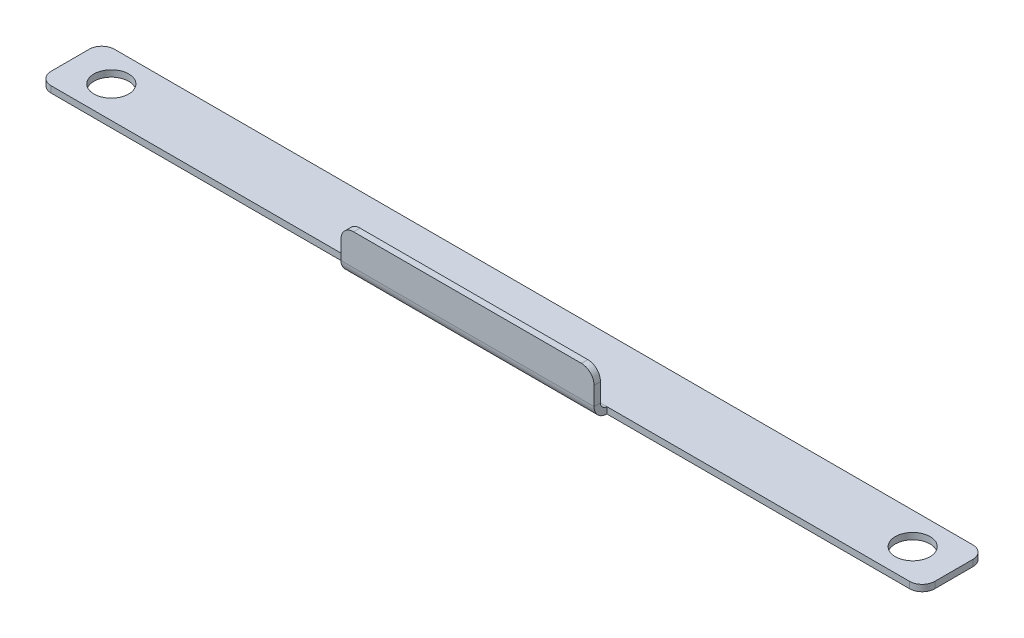
ISO-10303-21;
HEADER;
FILE_DESCRIPTION(('STEP AP214'),'2;1');
FILE_NAME('part.step','',(''),(''),'','','');
FILE_SCHEMA(('AUTOMOTIVE_DESIGN { 1 0 10303 214 1 1 1 1 }'));
ENDSEC;
DATA;
#1=APPLICATION_CONTEXT('core data for automotive mechanical design processes');
#2=APPLICATION_PROTOCOL_DEFINITION('international standard','automotive_design',2000,#1);
#3=PRODUCT_CONTEXT('',#1,'mechanical');
#4=PRODUCT('Part','Part','',(#3));
#5=PRODUCT_RELATED_PRODUCT_CATEGORY('part','',(#4));
#6=PRODUCT_DEFINITION_FORMATION('','',#4);
#7=PRODUCT_DEFINITION_CONTEXT('part definition',#1,'design');
#8=PRODUCT_DEFINITION('design','',#6,#7);
#9=PRODUCT_DEFINITION_SHAPE('','',#8);
#10=(LENGTH_UNIT() NAMED_UNIT(*) SI_UNIT(.MILLI.,.METRE.));
#11=(NAMED_UNIT(*) PLANE_ANGLE_UNIT() SI_UNIT($,.RADIAN.));
#12=(NAMED_UNIT(*) SI_UNIT($,.STERADIAN.) SOLID_ANGLE_UNIT());
#13=UNCERTAINTY_MEASURE_WITH_UNIT(LENGTH_MEASURE(1.E-05),#10,'distance_accuracy_value','');
#14=(GEOMETRIC_REPRESENTATION_CONTEXT(3) GLOBAL_UNCERTAINTY_ASSIGNED_CONTEXT((#13)) GLOBAL_UNIT_ASSIGNED_CONTEXT((#10,
#11,#12)) REPRESENTATION_CONTEXT('',''));
#15=CARTESIAN_POINT('',(0.,0.,0.));
#16=DIRECTION('',(0.,0.,1.));
#17=DIRECTION('',(1.,0.,0.));
#18=AXIS2_PLACEMENT_3D('',#15,#16,#17);
#19=CARTESIAN_POINT('',(-126.85050997759,-1.016,0.));
#20=DIRECTION('',(0.,0.,1.));
#21=DIRECTION('',(1.,0.,0.));
#22=AXIS2_PLACEMENT_3D('',#19,#20,#21);
#23=PLANE('',#22);
#24=DIRECTION('',(1.,0.,0.));
#25=VECTOR('',#24,1.);
#26=CARTESIAN_POINT('',(-126.85050997759,-1.016,0.));
#27=LINE('',#26,#25);
#28=CARTESIAN_POINT('',(-37.0255099775869,-1.016,0.));
#29=VERTEX_POINT('',#28);
#30=CARTESIAN_POINT('',(10.7994900224159,-1.016,0.));
#31=VERTEX_POINT('',#30);
#32=EDGE_CURVE('E246',#29,#31,#27,.T.);
#33=ORIENTED_EDGE('',*,*,#32,.T.);
#34=DIRECTION('',(0.,1.,0.));
#35=VECTOR('',#34,1.);
#36=CARTESIAN_POINT('',(10.7994900224159,-1.016,0.));
#37=LINE('',#36,#35);
#38=CARTESIAN_POINT('',(10.7994900224159,0.,0.));
#39=VERTEX_POINT('',#38);
#40=EDGE_CURVE('E13',#31,#39,#37,.T.);
#41=ORIENTED_EDGE('',*,*,#40,.T.);
#42=DIRECTION('',(1.,0.,0.));
#43=VECTOR('',#42,1.);
#44=CARTESIAN_POINT('',(-126.85050997759,0.,0.));
#45=LINE('',#44,#43);
#46=CARTESIAN_POINT('',(-37.0255099775869,0.,0.));
#47=VERTEX_POINT('',#46);
#48=EDGE_CURVE('E259',#47,#39,#45,.T.);
#49=ORIENTED_EDGE('',*,*,#48,.F.);
#50=DIRECTION('',(0.,-1.,0.));
#51=VECTOR('',#50,1.);
#52=CARTESIAN_POINT('',(-37.0255099775869,0.,0.));
#53=LINE('',#52,#51);
#54=EDGE_CURVE('E230',#47,#29,#53,.T.);
#55=ORIENTED_EDGE('',*,*,#54,.T.);
#56=EDGE_LOOP('',(#33,#41,#49,#55));
#57=FACE_BOUND('',#56,.T.);
#58=ADVANCED_FACE('F57',(#57),#23,.T.);
#59=CARTESIAN_POINT('',(-126.85050997759,-1.016,-10.));
#60=DIRECTION('',(-1.,0.,0.));
#61=DIRECTION('',(0.,0.,1.));
#62=AXIS2_PLACEMENT_3D('',#59,#60,#61);
#63=PLANE('',#62);
#64=DIRECTION('',(0.,0.,1.));
#65=VECTOR('',#64,1.);
#66=CARTESIAN_POINT('',(-126.85050997759,0.,-10.));
#67=LINE('',#66,#65);
#68=CARTESIAN_POINT('',(-126.85050997759,0.,-8.));
#69=VERTEX_POINT('',#68);
#70=CARTESIAN_POINT('',(-126.85050997759,0.,-2.));
#71=VERTEX_POINT('',#70);
#72=EDGE_CURVE('E241',#69,#71,#67,.T.);
#73=ORIENTED_EDGE('',*,*,#72,.F.);
#74=DIRECTION('',(0.,1.,0.));
#75=VECTOR('',#74,1.);
#76=CARTESIAN_POINT('',(-126.85050997759,-1.016,-8.));
#77=LINE('',#76,#75);
#78=CARTESIAN_POINT('',(-126.85050997759,-1.016,-8.));
#79=VERTEX_POINT('',#78);
#80=EDGE_CURVE('E299',#69,#79,#77,.F.);
#81=ORIENTED_EDGE('',*,*,#80,.T.);
#82=DIRECTION('',(0.,0.,1.));
#83=VECTOR('',#82,1.);
#84=CARTESIAN_POINT('',(-126.85050997759,-1.016,-10.));
#85=LINE('',#84,#83);
#86=CARTESIAN_POINT('',(-126.85050997759,-1.016,-2.));
#87=VERTEX_POINT('',#86);
#88=EDGE_CURVE('E243',#79,#87,#85,.T.);
#89=ORIENTED_EDGE('',*,*,#88,.T.);
#90=DIRECTION('',(0.,1.,0.));
#91=VECTOR('',#90,1.);
#92=CARTESIAN_POINT('',(-126.85050997759,-1.016,-2.));
#93=LINE('',#92,#91);
#94=EDGE_CURVE('E296',#87,#71,#93,.T.);
#95=ORIENTED_EDGE('',*,*,#94,.T.);
#96=EDGE_LOOP('',(#73,#81,#89,#95));
#97=FACE_BOUND('',#96,.T.);
#98=ADVANCED_FACE('F336',(#97),#63,.T.);
#99=CARTESIAN_POINT('',(-126.85050997759,-1.016,-10.));
#100=DIRECTION('',(0.,0.,-1.));
#101=DIRECTION('',(-1.,0.,0.));
#102=AXIS2_PLACEMENT_3D('',#99,#100,#101);
#103=PLANE('',#102);
#104=DIRECTION('',(-1.,0.,0.));
#105=VECTOR('',#104,1.);
#106=CARTESIAN_POINT('',(-126.85050997759,-1.016,-10.));
#107=LINE('',#106,#105);
#108=CARTESIAN_POINT('',(10.7994900224159,-1.016,-10.));
#109=VERTEX_POINT('',#108);
#110=CARTESIAN_POINT('',(-124.85050997759,-1.016,-10.));
#111=VERTEX_POINT('',#110);
#112=EDGE_CURVE('E253',#109,#111,#107,.T.);
#113=ORIENTED_EDGE('',*,*,#112,.T.);
#114=DIRECTION('',(0.,1.,0.));
#115=VECTOR('',#114,1.);
#116=CARTESIAN_POINT('',(-124.85050997759,-1.016,-10.));
#117=LINE('',#116,#115);
#118=CARTESIAN_POINT('',(-124.85050997759,0.,-10.));
#119=VERTEX_POINT('',#118);
#120=EDGE_CURVE('E285',#111,#119,#117,.T.);
#121=ORIENTED_EDGE('',*,*,#120,.T.);
#122=DIRECTION('',(-1.,0.,0.));
#123=VECTOR('',#122,1.);
#124=CARTESIAN_POINT('',(-126.85050997759,0.,-10.));
#125=LINE('',#124,#123);
#126=CARTESIAN_POINT('',(10.7994900224159,0.,-10.));
#127=VERTEX_POINT('',#126);
#128=EDGE_CURVE('E247',#127,#119,#125,.T.);
#129=ORIENTED_EDGE('',*,*,#128,.F.);
#130=DIRECTION('',(0.,1.,0.));
#131=VECTOR('',#130,1.);
#132=CARTESIAN_POINT('',(10.7994900224159,-1.016,-10.));
#133=LINE('',#132,#131);
#134=EDGE_CURVE('E283',#127,#109,#133,.F.);
#135=ORIENTED_EDGE('',*,*,#134,.T.);
#136=EDGE_LOOP('',(#113,#121,#129,#135));
#137=FACE_BOUND('',#136,.T.);
#138=ADVANCED_FACE('F343',(#137),#103,.T.);
#139=CARTESIAN_POINT('',(12.7994900224159,-1.016,-10.));
#140=DIRECTION('',(1.,0.,0.));
#141=DIRECTION('',(0.,0.,-1.));
#142=AXIS2_PLACEMENT_3D('',#139,#140,#141);
#143=PLANE('',#142);
#144=DIRECTION('',(0.,0.,-1.));
#145=VECTOR('',#144,1.);
#146=CARTESIAN_POINT('',(12.7994900224159,-1.016,-10.));
#147=LINE('',#146,#145);
#148=CARTESIAN_POINT('',(12.7994900224159,-1.016,-2.));
#149=VERTEX_POINT('',#148);
#150=CARTESIAN_POINT('',(12.7994900224159,-1.016,-8.));
#151=VERTEX_POINT('',#150);
#152=EDGE_CURVE('E250',#149,#151,#147,.T.);
#153=ORIENTED_EDGE('',*,*,#152,.T.);
#154=DIRECTION('',(0.,1.,0.));
#155=VECTOR('',#154,1.);
#156=CARTESIAN_POINT('',(12.7994900224159,-1.016,-8.));
#157=LINE('',#156,#155);
#158=CARTESIAN_POINT('',(12.7994900224159,0.,-8.));
#159=VERTEX_POINT('',#158);
#160=EDGE_CURVE('E65',#151,#159,#157,.T.);
#161=ORIENTED_EDGE('',*,*,#160,.T.);
#162=DIRECTION('',(0.,0.,-1.));
#163=VECTOR('',#162,1.);
#164=CARTESIAN_POINT('',(12.7994900224159,0.,-10.));
#165=LINE('',#164,#163);
#166=CARTESIAN_POINT('',(12.7994900224159,0.,-2.));
#167=VERTEX_POINT('',#166);
#168=EDGE_CURVE('E262',#167,#159,#165,.T.);
#169=ORIENTED_EDGE('',*,*,#168,.F.);
#170=DIRECTION('',(0.,1.,0.));
#171=VECTOR('',#170,1.);
#172=CARTESIAN_POINT('',(12.7994900224159,-1.016,-2.));
#173=LINE('',#172,#171);
#174=EDGE_CURVE('E309',#167,#149,#173,.F.);
#175=ORIENTED_EDGE('',*,*,#174,.T.);
#176=EDGE_LOOP('',(#153,#161,#169,#175));
#177=FACE_BOUND('',#176,.T.);
#178=ADVANCED_FACE('F314',(#177),#143,.T.);
#179=CARTESIAN_POINT('',(-124.85050997759,0.,0.));
#180=VERTEX_POINT('',#179);
#181=CARTESIAN_POINT('',(-77.0255099775869,0.,0.));
#182=VERTEX_POINT('',#181);
#183=EDGE_CURVE('E260',#180,#182,#45,.T.);
#184=ORIENTED_EDGE('',*,*,#183,.F.);
#185=DIRECTION('',(0.,1.,0.));
#186=VECTOR('',#185,1.);
#187=CARTESIAN_POINT('',(-124.85050997759,-1.016,0.));
#188=LINE('',#187,#186);
#189=CARTESIAN_POINT('',(-124.85050997759,-1.016,0.));
#190=VERTEX_POINT('',#189);
#191=EDGE_CURVE('E72',#180,#190,#188,.F.);
#192=ORIENTED_EDGE('',*,*,#191,.T.);
#193=CARTESIAN_POINT('',(-77.0255099775869,-1.01600000000003,0.));
#194=VERTEX_POINT('',#193);
#195=EDGE_CURVE('E248',#190,#194,#27,.T.);
#196=ORIENTED_EDGE('',*,*,#195,.T.);
#197=DIRECTION('',(0.,-1.,0.));
#198=VECTOR('',#197,1.);
#199=CARTESIAN_POINT('',(-77.0255099775869,0.,0.));
#200=LINE('',#199,#198);
#201=EDGE_CURVE('E238',#182,#194,#200,.T.);
#202=ORIENTED_EDGE('',*,*,#201,.F.);
#203=EDGE_LOOP('',(#184,#192,#196,#202));
#204=FACE_BOUND('',#203,.T.);
#205=ADVANCED_FACE('F356',(#204),#23,.T.);
#206=CARTESIAN_POINT('',(0.,-1.016,0.));
#207=DIRECTION('',(0.,1.,0.));
#208=DIRECTION('',(0.,0.,1.));
#209=AXIS2_PLACEMENT_3D('',#206,#207,#208);
#210=PLANE('',#209);
#211=CARTESIAN_POINT('',(-120.35050997759,-1.01600000000003,-4.99999999999999));
#212=DIRECTION('',(0.,1.,0.));
#213=DIRECTION('',(0.,0.,1.));
#214=AXIS2_PLACEMENT_3D('',#211,#212,#213);
#215=CIRCLE('',#214,2.75);
#216=CARTESIAN_POINT('',(-120.35050997759,-1.01600000000003,-2.24999999999999));
#217=VERTEX_POINT('',#216);
#218=EDGE_CURVE('E602',#217,#217,#215,.T.);
#219=ORIENTED_EDGE('',*,*,#218,.T.);
#220=EDGE_LOOP('',(#219));
#221=FACE_BOUND('',#220,.T.);
#222=CARTESIAN_POINT('',(6.29949002241591,-1.01600000000003,-5.));
#223=DIRECTION('',(0.,1.,0.));
#224=DIRECTION('',(0.,0.,1.));
#225=AXIS2_PLACEMENT_3D('',#222,#223,#224);
#226=CIRCLE('',#225,2.75);
#227=CARTESIAN_POINT('',(6.29949002241591,-1.01600000000003,-2.25));
#228=VERTEX_POINT('',#227);
#229=EDGE_CURVE('E227',#228,#228,#226,.T.);
#230=ORIENTED_EDGE('',*,*,#229,.T.);
#231=EDGE_LOOP('',(#230));
#232=FACE_BOUND('',#231,.T.);
#233=ORIENTED_EDGE('',*,*,#88,.F.);
#234=CARTESIAN_POINT('',(-124.85050997759,-1.016,-8.));
#235=DIRECTION('',(0.,1.,0.));
#236=DIRECTION('',(0.,0.,1.));
#237=AXIS2_PLACEMENT_3D('',#234,#235,#236);
#238=CIRCLE('',#237,2.);
#239=EDGE_CURVE('E306',#79,#111,#238,.F.);
#240=ORIENTED_EDGE('',*,*,#239,.T.);
#241=ORIENTED_EDGE('',*,*,#112,.F.);
#242=CARTESIAN_POINT('',(10.7994900224159,-1.016,-8.));
#243=DIRECTION('',(0.,1.,0.));
#244=DIRECTION('',(0.,0.,1.));
#245=AXIS2_PLACEMENT_3D('',#242,#243,#244);
#246=CIRCLE('',#245,2.);
#247=EDGE_CURVE('E302',#109,#151,#246,.F.);
#248=ORIENTED_EDGE('',*,*,#247,.T.);
#249=ORIENTED_EDGE('',*,*,#152,.F.);
#250=CARTESIAN_POINT('',(10.7994900224159,-1.016,-2.));
#251=DIRECTION('',(0.,1.,0.));
#252=DIRECTION('',(0.,0.,1.));
#253=AXIS2_PLACEMENT_3D('',#250,#251,#252);
#254=CIRCLE('',#253,2.);
#255=EDGE_CURVE('E80',#149,#31,#254,.F.);
#256=ORIENTED_EDGE('',*,*,#255,.T.);
#257=ORIENTED_EDGE('',*,*,#32,.F.);
#258=DIRECTION('',(1.,0.,0.));
#259=VECTOR('',#258,1.);
#260=CARTESIAN_POINT('',(-37.0255099775869,-1.01600000000002,0.));
#261=LINE('',#260,#259);
#262=EDGE_CURVE('E181',#29,#194,#261,.F.);
#263=ORIENTED_EDGE('',*,*,#262,.T.);
#264=ORIENTED_EDGE('',*,*,#195,.F.);
#265=CARTESIAN_POINT('',(-124.85050997759,-1.016,-2.));
#266=DIRECTION('',(0.,1.,0.));
#267=DIRECTION('',(0.,0.,1.));
#268=AXIS2_PLACEMENT_3D('',#265,#266,#267);
#269=CIRCLE('',#268,2.);
#270=EDGE_CURVE('E304',#190,#87,#269,.F.);
#271=ORIENTED_EDGE('',*,*,#270,.T.);
#272=EDGE_LOOP('',(#233,#240,#241,#248,#249,#256,#257,#263,#264,#271));
#273=FACE_BOUND('',#272,.T.);
#274=ADVANCED_FACE('F328',(#221,#232,#273),#210,.F.);
#275=CARTESIAN_POINT('',(0.,0.,0.));
#276=DIRECTION('',(0.,1.,0.));
#277=DIRECTION('',(0.,0.,1.));
#278=AXIS2_PLACEMENT_3D('',#275,#276,#277);
#279=PLANE('',#278);
#280=CARTESIAN_POINT('',(-120.35050997759,0.,-4.99999999999999));
#281=DIRECTION('',(0.,1.,0.));
#282=DIRECTION('',(0.,0.,1.));
#283=AXIS2_PLACEMENT_3D('',#280,#281,#282);
#284=CIRCLE('',#283,2.75);
#285=CARTESIAN_POINT('',(-120.35050997759,0.,-2.24999999999999));
#286=VERTEX_POINT('',#285);
#287=EDGE_CURVE('E605',#286,#286,#284,.T.);
#288=ORIENTED_EDGE('',*,*,#287,.F.);
#289=EDGE_LOOP('',(#288));
#290=FACE_BOUND('',#289,.T.);
#291=CARTESIAN_POINT('',(6.29949002241591,0.,-5.));
#292=DIRECTION('',(0.,1.,0.));
#293=DIRECTION('',(0.,0.,1.));
#294=AXIS2_PLACEMENT_3D('',#291,#292,#293);
#295=CIRCLE('',#294,2.75);
#296=CARTESIAN_POINT('',(6.29949002241591,0.,-2.25));
#297=VERTEX_POINT('',#296);
#298=EDGE_CURVE('E607',#297,#297,#295,.T.);
#299=ORIENTED_EDGE('',*,*,#298,.F.);
#300=EDGE_LOOP('',(#299));
#301=FACE_BOUND('',#300,.T.);
#302=ORIENTED_EDGE('',*,*,#128,.T.);
#303=CARTESIAN_POINT('',(-124.85050997759,0.,-8.));
#304=DIRECTION('',(0.,1.,0.));
#305=DIRECTION('',(0.,0.,1.));
#306=AXIS2_PLACEMENT_3D('',#303,#304,#305);
#307=CIRCLE('',#306,2.);
#308=EDGE_CURVE('E294',#119,#69,#307,.T.);
#309=ORIENTED_EDGE('',*,*,#308,.T.);
#310=ORIENTED_EDGE('',*,*,#72,.T.);
#311=CARTESIAN_POINT('',(-124.85050997759,0.,-2.));
#312=DIRECTION('',(0.,1.,0.));
#313=DIRECTION('',(0.,0.,1.));
#314=AXIS2_PLACEMENT_3D('',#311,#312,#313);
#315=CIRCLE('',#314,2.);
#316=EDGE_CURVE('E292',#71,#180,#315,.T.);
#317=ORIENTED_EDGE('',*,*,#316,.T.);
#318=ORIENTED_EDGE('',*,*,#183,.T.);
#319=DIRECTION('',(1.,0.,0.));
#320=VECTOR('',#319,1.);
#321=CARTESIAN_POINT('',(-37.0255099775869,0.,0.));
#322=LINE('',#321,#320);
#323=EDGE_CURVE('E234',#47,#182,#322,.F.);
#324=ORIENTED_EDGE('',*,*,#323,.F.);
#325=ORIENTED_EDGE('',*,*,#48,.T.);
#326=CARTESIAN_POINT('',(10.7994900224159,0.,-2.));
#327=DIRECTION('',(0.,1.,0.));
#328=DIRECTION('',(0.,0.,1.));
#329=AXIS2_PLACEMENT_3D('',#326,#327,#328);
#330=CIRCLE('',#329,2.);
#331=EDGE_CURVE('E288',#39,#167,#330,.T.);
#332=ORIENTED_EDGE('',*,*,#331,.T.);
#333=ORIENTED_EDGE('',*,*,#168,.T.);
#334=CARTESIAN_POINT('',(10.7994900224159,0.,-8.));
#335=DIRECTION('',(0.,1.,0.));
#336=DIRECTION('',(0.,0.,1.));
#337=AXIS2_PLACEMENT_3D('',#334,#335,#336);
#338=CIRCLE('',#337,2.);
#339=EDGE_CURVE('E290',#159,#127,#338,.T.);
#340=ORIENTED_EDGE('',*,*,#339,.T.);
#341=EDGE_LOOP('',(#302,#309,#310,#317,#318,#324,#325,#332,#333,#340));
#342=FACE_BOUND('',#341,.T.);
#343=ADVANCED_FACE('F319',(#290,#301,#342),#279,.T.);
#344=CARTESIAN_POINT('',(-77.0255099775869,1.01599999999998,0.));
#345=DIRECTION('',(-1.,0.,0.));
#346=DIRECTION('',(0.,-1.,0.));
#347=AXIS2_PLACEMENT_3D('',#344,#345,#346);
#348=PLANE('',#347);
#349=DIRECTION('',(0.,0.,-1.));
#350=VECTOR('',#349,1.);
#351=CARTESIAN_POINT('',(-77.0255099775869,1.01599999999998,2.032));
#352=LINE('',#351,#350);
#353=CARTESIAN_POINT('',(-77.0255099775869,1.01599999999998,1.01600000000001));
#354=VERTEX_POINT('',#353);
#355=CARTESIAN_POINT('',(-77.0255099775869,1.01599999999998,2.03200000000001));
#356=VERTEX_POINT('',#355);
#357=EDGE_CURVE('E224',#354,#356,#352,.F.);
#358=ORIENTED_EDGE('',*,*,#357,.F.);
#359=CARTESIAN_POINT('',(-77.0255099775869,1.01599999999998,0.));
#360=DIRECTION('',(1.,0.,0.));
#361=DIRECTION('',(0.,1.,0.));
#362=AXIS2_PLACEMENT_3D('',#359,#360,#361);
#363=CIRCLE('',#362,1.01600000000001);
#364=EDGE_CURVE('E184',#182,#354,#363,.F.);
#365=ORIENTED_EDGE('',*,*,#364,.F.);
#366=ORIENTED_EDGE('',*,*,#201,.T.);
#367=CARTESIAN_POINT('',(-77.0255099775869,1.01599999999998,0.));
#368=DIRECTION('',(1.,0.,0.));
#369=DIRECTION('',(0.,1.,0.));
#370=AXIS2_PLACEMENT_3D('',#367,#368,#369);
#371=CIRCLE('',#370,2.03200000000001);
#372=EDGE_CURVE('E229',#194,#356,#371,.F.);
#373=ORIENTED_EDGE('',*,*,#372,.T.);
#374=EDGE_LOOP('',(#358,#365,#366,#373));
#375=FACE_BOUND('',#374,.T.);
#376=ADVANCED_FACE('F375',(#375),#348,.T.);
#377=CARTESIAN_POINT('',(-37.0255099775869,1.01599999999999,0.));
#378=DIRECTION('',(-1.,0.,0.));
#379=DIRECTION('',(0.,-1.,0.));
#380=AXIS2_PLACEMENT_3D('',#377,#378,#379);
#381=PLANE('',#380);
#382=CARTESIAN_POINT('',(-37.0255099775869,1.01599999999999,0.));
#383=DIRECTION('',(1.,0.,0.));
#384=DIRECTION('',(0.,1.,0.));
#385=AXIS2_PLACEMENT_3D('',#382,#383,#384);
#386=CIRCLE('',#385,1.01600000000001);
#387=CARTESIAN_POINT('',(-37.0255099775869,1.01599999999999,1.01600000000001));
#388=VERTEX_POINT('',#387);
#389=EDGE_CURVE('E191',#388,#47,#386,.T.);
#390=ORIENTED_EDGE('',*,*,#389,.F.);
#391=DIRECTION('',(0.,0.,-1.));
#392=VECTOR('',#391,1.);
#393=CARTESIAN_POINT('',(-37.0255099775869,1.01599999999999,1.01600000000002));
#394=LINE('',#393,#392);
#395=CARTESIAN_POINT('',(-37.0255099775869,1.01599999999999,2.032));
#396=VERTEX_POINT('',#395);
#397=EDGE_CURVE('E188',#388,#396,#394,.F.);
#398=ORIENTED_EDGE('',*,*,#397,.T.);
#399=CARTESIAN_POINT('',(-37.0255099775869,1.01599999999999,0.));
#400=DIRECTION('',(1.,0.,0.));
#401=DIRECTION('',(0.,1.,0.));
#402=AXIS2_PLACEMENT_3D('',#399,#400,#401);
#403=CIRCLE('',#402,2.03200000000001);
#404=EDGE_CURVE('E173',#396,#29,#403,.T.);
#405=ORIENTED_EDGE('',*,*,#404,.T.);
#406=ORIENTED_EDGE('',*,*,#54,.F.);
#407=EDGE_LOOP('',(#390,#398,#405,#406));
#408=FACE_BOUND('',#407,.T.);
#409=ADVANCED_FACE('F189',(#408),#381,.F.);
#410=CARTESIAN_POINT('',(-37.0255099775869,1.01599999999999,0.));
#411=DIRECTION('',(1.,0.,0.));
#412=DIRECTION('',(0.,0.,1.));
#413=AXIS2_PLACEMENT_3D('',#410,#411,#412);
#414=CYLINDRICAL_SURFACE('',#413,2.03200000000001);
#415=ORIENTED_EDGE('',*,*,#262,.F.);
#416=ORIENTED_EDGE('',*,*,#404,.F.);
#417=DIRECTION('',(1.,0.,0.));
#418=VECTOR('',#417,1.);
#419=CARTESIAN_POINT('',(-77.0255099775869,1.01599999999998,2.032));
#420=LINE('',#419,#418);
#421=EDGE_CURVE('E178',#396,#356,#420,.F.);
#422=ORIENTED_EDGE('',*,*,#421,.T.);
#423=ORIENTED_EDGE('',*,*,#372,.F.);
#424=EDGE_LOOP('',(#415,#416,#422,#423));
#425=FACE_BOUND('',#424,.T.);
#426=ADVANCED_FACE('F175',(#425),#414,.T.);
#427=CARTESIAN_POINT('',(-37.0255099775869,1.01599999999999,0.));
#428=DIRECTION('',(1.,0.,0.));
#429=DIRECTION('',(0.,0.,1.));
#430=AXIS2_PLACEMENT_3D('',#427,#428,#429);
#431=CYLINDRICAL_SURFACE('',#430,1.01600000000001);
#432=ORIENTED_EDGE('',*,*,#323,.T.);
#433=ORIENTED_EDGE('',*,*,#364,.T.);
#434=DIRECTION('',(1.,0.,0.));
#435=VECTOR('',#434,1.);
#436=CARTESIAN_POINT('',(-77.0255099775869,1.01599999999998,1.01600000000002));
#437=LINE('',#436,#435);
#438=EDGE_CURVE('E196',#354,#388,#437,.T.);
#439=ORIENTED_EDGE('',*,*,#438,.T.);
#440=ORIENTED_EDGE('',*,*,#389,.T.);
#441=EDGE_LOOP('',(#432,#433,#439,#440));
#442=FACE_BOUND('',#441,.T.);
#443=ADVANCED_FACE('F371',(#442),#431,.F.);
#444=CARTESIAN_POINT('',(-77.0255099775869,0.,2.032));
#445=DIRECTION('',(1.,0.,0.));
#446=DIRECTION('',(0.,0.,-1.));
#447=AXIS2_PLACEMENT_3D('',#444,#445,#446);
#448=PLANE('',#447);
#449=DIRECTION('',(0.,-1.,0.));
#450=VECTOR('',#449,1.);
#451=CARTESIAN_POINT('',(-77.0255099775869,0.,2.032));
#452=LINE('',#451,#450);
#453=CARTESIAN_POINT('',(-77.0255099775869,3.94,2.032));
#454=VERTEX_POINT('',#453);
#455=EDGE_CURVE('E205',#454,#356,#452,.T.);
#456=ORIENTED_EDGE('',*,*,#455,.F.);
#457=DIRECTION('',(0.,0.,-1.));
#458=VECTOR('',#457,1.);
#459=CARTESIAN_POINT('',(-77.0255099775869,3.94,2.032));
#460=LINE('',#459,#458);
#461=CARTESIAN_POINT('',(-77.0255099775869,3.94,1.016));
#462=VERTEX_POINT('',#461);
#463=EDGE_CURVE('E256',#454,#462,#460,.T.);
#464=ORIENTED_EDGE('',*,*,#463,.T.);
#465=DIRECTION('',(0.,1.,0.));
#466=VECTOR('',#465,1.);
#467=CARTESIAN_POINT('',(-77.0255099775869,0.,1.016));
#468=LINE('',#467,#466);
#469=EDGE_CURVE('E206',#462,#354,#468,.F.);
#470=ORIENTED_EDGE('',*,*,#469,.T.);
#471=ORIENTED_EDGE('',*,*,#357,.T.);
#472=EDGE_LOOP('',(#456,#464,#470,#471));
#473=FACE_BOUND('',#472,.T.);
#474=ADVANCED_FACE('F377',(#473),#448,.F.);
#475=CARTESIAN_POINT('',(-37.0255099775869,5.94000000000001,2.032));
#476=DIRECTION('',(-1.,0.,0.));
#477=DIRECTION('',(0.,0.,1.));
#478=AXIS2_PLACEMENT_3D('',#475,#476,#477);
#479=PLANE('',#478);
#480=DIRECTION('',(0.,-1.,0.));
#481=VECTOR('',#480,1.);
#482=CARTESIAN_POINT('',(-37.0255099775869,5.94000000000001,1.016));
#483=LINE('',#482,#481);
#484=CARTESIAN_POINT('',(-37.0255099775869,3.94000000000001,1.016));
#485=VERTEX_POINT('',#484);
#486=EDGE_CURVE('E220',#388,#485,#483,.F.);
#487=ORIENTED_EDGE('',*,*,#486,.T.);
#488=DIRECTION('',(0.,0.,-1.));
#489=VECTOR('',#488,1.);
#490=CARTESIAN_POINT('',(-37.0255099775869,3.94000000000001,2.032));
#491=LINE('',#490,#489);
#492=CARTESIAN_POINT('',(-37.0255099775869,3.94000000000001,2.032));
#493=VERTEX_POINT('',#492);
#494=EDGE_CURVE('E210',#485,#493,#491,.F.);
#495=ORIENTED_EDGE('',*,*,#494,.T.);
#496=DIRECTION('',(0.,1.,0.));
#497=VECTOR('',#496,1.);
#498=CARTESIAN_POINT('',(-37.0255099775869,0.,2.032));
#499=LINE('',#498,#497);
#500=EDGE_CURVE('E202',#396,#493,#499,.T.);
#501=ORIENTED_EDGE('',*,*,#500,.F.);
#502=ORIENTED_EDGE('',*,*,#397,.F.);
#503=EDGE_LOOP('',(#487,#495,#501,#502));
#504=FACE_BOUND('',#503,.T.);
#505=ADVANCED_FACE('F208',(#504),#479,.F.);
#506=CARTESIAN_POINT('',(0.,0.,2.032));
#507=DIRECTION('',(0.,0.,-1.));
#508=DIRECTION('',(-1.,0.,0.));
#509=AXIS2_PLACEMENT_3D('',#506,#507,#508);
#510=PLANE('',#509);
#511=DIRECTION('',(-1.,0.,0.));
#512=VECTOR('',#511,1.);
#513=CARTESIAN_POINT('',(0.,5.94000000000002,2.032));
#514=LINE('',#513,#512);
#515=CARTESIAN_POINT('',(-39.0255099775869,5.94000000000001,2.032));
#516=VERTEX_POINT('',#515);
#517=CARTESIAN_POINT('',(-75.0255099775869,5.94,2.032));
#518=VERTEX_POINT('',#517);
#519=EDGE_CURVE('E211',#516,#518,#514,.T.);
#520=ORIENTED_EDGE('',*,*,#519,.T.);
#521=CARTESIAN_POINT('',(-75.0255099775869,3.94,2.032));
#522=DIRECTION('',(0.,0.,-1.));
#523=DIRECTION('',(-1.,0.,0.));
#524=AXIS2_PLACEMENT_3D('',#521,#522,#523);
#525=CIRCLE('',#524,2.);
#526=EDGE_CURVE('E280',#518,#454,#525,.F.);
#527=ORIENTED_EDGE('',*,*,#526,.T.);
#528=ORIENTED_EDGE('',*,*,#455,.T.);
#529=ORIENTED_EDGE('',*,*,#421,.F.);
#530=ORIENTED_EDGE('',*,*,#500,.T.);
#531=CARTESIAN_POINT('',(-39.0255099775869,3.94000000000001,2.032));
#532=DIRECTION('',(0.,0.,-1.));
#533=DIRECTION('',(-1.,0.,0.));
#534=AXIS2_PLACEMENT_3D('',#531,#532,#533);
#535=CIRCLE('',#534,2.);
#536=EDGE_CURVE('E278',#493,#516,#535,.F.);
#537=ORIENTED_EDGE('',*,*,#536,.T.);
#538=EDGE_LOOP('',(#520,#527,#528,#529,#530,#537));
#539=FACE_BOUND('',#538,.T.);
#540=ADVANCED_FACE('F201',(#539),#510,.F.);
#541=CARTESIAN_POINT('',(0.,0.,1.016));
#542=DIRECTION('',(0.,0.,-1.));
#543=DIRECTION('',(-1.,0.,0.));
#544=AXIS2_PLACEMENT_3D('',#541,#542,#543);
#545=PLANE('',#544);
#546=ORIENTED_EDGE('',*,*,#469,.F.);
#547=CARTESIAN_POINT('',(-75.0255099775869,3.94,1.016));
#548=DIRECTION('',(0.,0.,-1.));
#549=DIRECTION('',(-1.,0.,0.));
#550=AXIS2_PLACEMENT_3D('',#547,#548,#549);
#551=CIRCLE('',#550,2.);
#552=CARTESIAN_POINT('',(-75.0255099775869,5.94,1.016));
#553=VERTEX_POINT('',#552);
#554=EDGE_CURVE('E271',#462,#553,#551,.T.);
#555=ORIENTED_EDGE('',*,*,#554,.T.);
#556=DIRECTION('',(1.,0.,0.));
#557=VECTOR('',#556,1.);
#558=CARTESIAN_POINT('',(-77.0255099775869,5.94,1.016));
#559=LINE('',#558,#557);
#560=CARTESIAN_POINT('',(-39.0255099775869,5.94000000000001,1.016));
#561=VERTEX_POINT('',#560);
#562=EDGE_CURVE('E214',#561,#553,#559,.F.);
#563=ORIENTED_EDGE('',*,*,#562,.F.);
#564=CARTESIAN_POINT('',(-39.0255099775869,3.94000000000001,1.016));
#565=DIRECTION('',(0.,0.,-1.));
#566=DIRECTION('',(-1.,0.,0.));
#567=AXIS2_PLACEMENT_3D('',#564,#565,#566);
#568=CIRCLE('',#567,2.);
#569=EDGE_CURVE('E269',#561,#485,#568,.T.);
#570=ORIENTED_EDGE('',*,*,#569,.T.);
#571=ORIENTED_EDGE('',*,*,#486,.F.);
#572=ORIENTED_EDGE('',*,*,#438,.F.);
#573=EDGE_LOOP('',(#546,#555,#563,#570,#571,#572));
#574=FACE_BOUND('',#573,.T.);
#575=ADVANCED_FACE('F381',(#574),#545,.T.);
#576=CARTESIAN_POINT('',(-77.0255099775869,5.94,2.032));
#577=DIRECTION('',(0.,-1.,0.));
#578=DIRECTION('',(1.,0.,0.));
#579=AXIS2_PLACEMENT_3D('',#576,#577,#578);
#580=PLANE('',#579);
#581=ORIENTED_EDGE('',*,*,#562,.T.);
#582=DIRECTION('',(0.,0.,-1.));
#583=VECTOR('',#582,1.);
#584=CARTESIAN_POINT('',(-75.0255099775869,5.94,2.032));
#585=LINE('',#584,#583);
#586=EDGE_CURVE('E276',#553,#518,#585,.F.);
#587=ORIENTED_EDGE('',*,*,#586,.T.);
#588=ORIENTED_EDGE('',*,*,#519,.F.);
#589=DIRECTION('',(0.,0.,-1.));
#590=VECTOR('',#589,1.);
#591=CARTESIAN_POINT('',(-39.0255099775869,5.94000000000001,2.032));
#592=LINE('',#591,#590);
#593=EDGE_CURVE('E273',#516,#561,#592,.T.);
#594=ORIENTED_EDGE('',*,*,#593,.T.);
#595=EDGE_LOOP('',(#581,#587,#588,#594));
#596=FACE_BOUND('',#595,.T.);
#597=ADVANCED_FACE('F389',(#596),#580,.F.);
#598=CARTESIAN_POINT('',(-75.0255099775869,3.94,2.032));
#599=DIRECTION('',(0.,0.,-1.));
#600=DIRECTION('',(-1.,0.,0.));
#601=AXIS2_PLACEMENT_3D('',#598,#599,#600);
#602=CYLINDRICAL_SURFACE('',#601,2.);
#603=ORIENTED_EDGE('',*,*,#526,.F.);
#604=ORIENTED_EDGE('',*,*,#586,.F.);
#605=ORIENTED_EDGE('',*,*,#554,.F.);
#606=ORIENTED_EDGE('',*,*,#463,.F.);
#607=EDGE_LOOP('',(#603,#604,#605,#606));
#608=FACE_BOUND('',#607,.T.);
#609=ADVANCED_FACE('F392',(#608),#602,.T.);
#610=CARTESIAN_POINT('',(-39.0255099775869,3.94000000000001,2.032));
#611=DIRECTION('',(0.,0.,-1.));
#612=DIRECTION('',(-1.,0.,0.));
#613=AXIS2_PLACEMENT_3D('',#610,#611,#612);
#614=CYLINDRICAL_SURFACE('',#613,2.);
#615=ORIENTED_EDGE('',*,*,#536,.F.);
#616=ORIENTED_EDGE('',*,*,#494,.F.);
#617=ORIENTED_EDGE('',*,*,#569,.F.);
#618=ORIENTED_EDGE('',*,*,#593,.F.);
#619=EDGE_LOOP('',(#615,#616,#617,#618));
#620=FACE_BOUND('',#619,.T.);
#621=ADVANCED_FACE('F384',(#620),#614,.T.);
#622=CARTESIAN_POINT('',(-124.85050997759,-1.016,-8.));
#623=DIRECTION('',(0.,1.,0.));
#624=DIRECTION('',(0.,0.,1.));
#625=AXIS2_PLACEMENT_3D('',#622,#623,#624);
#626=CYLINDRICAL_SURFACE('',#625,2.);
#627=ORIENTED_EDGE('',*,*,#239,.F.);
#628=ORIENTED_EDGE('',*,*,#80,.F.);
#629=ORIENTED_EDGE('',*,*,#308,.F.);
#630=ORIENTED_EDGE('',*,*,#120,.F.);
#631=EDGE_LOOP('',(#627,#628,#629,#630));
#632=FACE_BOUND('',#631,.T.);
#633=ADVANCED_FACE('F341',(#632),#626,.T.);
#634=CARTESIAN_POINT('',(-124.85050997759,-1.016,-2.));
#635=DIRECTION('',(0.,1.,0.));
#636=DIRECTION('',(0.,0.,1.));
#637=AXIS2_PLACEMENT_3D('',#634,#635,#636);
#638=CYLINDRICAL_SURFACE('',#637,2.);
#639=ORIENTED_EDGE('',*,*,#270,.F.);
#640=ORIENTED_EDGE('',*,*,#191,.F.);
#641=ORIENTED_EDGE('',*,*,#316,.F.);
#642=ORIENTED_EDGE('',*,*,#94,.F.);
#643=EDGE_LOOP('',(#639,#640,#641,#642));
#644=FACE_BOUND('',#643,.T.);
#645=ADVANCED_FACE('F333',(#644),#638,.T.);
#646=CARTESIAN_POINT('',(10.7994900224159,-1.016,-8.));
#647=DIRECTION('',(0.,1.,0.));
#648=DIRECTION('',(0.,0.,1.));
#649=AXIS2_PLACEMENT_3D('',#646,#647,#648);
#650=CYLINDRICAL_SURFACE('',#649,2.);
#651=ORIENTED_EDGE('',*,*,#247,.F.);
#652=ORIENTED_EDGE('',*,*,#134,.F.);
#653=ORIENTED_EDGE('',*,*,#339,.F.);
#654=ORIENTED_EDGE('',*,*,#160,.F.);
#655=EDGE_LOOP('',(#651,#652,#653,#654));
#656=FACE_BOUND('',#655,.T.);
#657=ADVANCED_FACE('F346',(#656),#650,.T.);
#658=CARTESIAN_POINT('',(10.7994900224159,-1.016,-2.));
#659=DIRECTION('',(0.,1.,0.));
#660=DIRECTION('',(0.,0.,1.));
#661=AXIS2_PLACEMENT_3D('',#658,#659,#660);
#662=CYLINDRICAL_SURFACE('',#661,2.);
#663=ORIENTED_EDGE('',*,*,#255,.F.);
#664=ORIENTED_EDGE('',*,*,#174,.F.);
#665=ORIENTED_EDGE('',*,*,#331,.F.);
#666=ORIENTED_EDGE('',*,*,#40,.F.);
#667=EDGE_LOOP('',(#663,#664,#665,#666));
#668=FACE_BOUND('',#667,.T.);
#669=ADVANCED_FACE('F59',(#668),#662,.T.);
#670=CARTESIAN_POINT('',(6.29949002241591,0.,-5.));
#671=DIRECTION('',(0.,1.,0.));
#672=DIRECTION('',(0.,0.,1.));
#673=AXIS2_PLACEMENT_3D('',#670,#671,#672);
#674=CYLINDRICAL_SURFACE('',#673,2.75);
#675=ORIENTED_EDGE('',*,*,#229,.F.);
#676=EDGE_LOOP('',(#675));
#677=FACE_BOUND('',#676,.T.);
#678=ORIENTED_EDGE('',*,*,#298,.T.);
#679=EDGE_LOOP('',(#678));
#680=FACE_BOUND('',#679,.T.);
#681=ADVANCED_FACE('F352',(#677,#680),#674,.F.);
#682=CARTESIAN_POINT('',(-120.35050997759,0.,-4.99999999999999));
#683=DIRECTION('',(0.,1.,0.));
#684=DIRECTION('',(0.,0.,1.));
#685=AXIS2_PLACEMENT_3D('',#682,#683,#684);
#686=CYLINDRICAL_SURFACE('',#685,2.75);
#687=ORIENTED_EDGE('',*,*,#218,.F.);
#688=EDGE_LOOP('',(#687));
#689=FACE_BOUND('',#688,.T.);
#690=ORIENTED_EDGE('',*,*,#287,.T.);
#691=EDGE_LOOP('',(#690));
#692=FACE_BOUND('',#691,.T.);
#693=ADVANCED_FACE('F450',(#689,#692),#686,.F.);
#694=CLOSED_SHELL('',(#58,#98,#138,#178,#205,#274,#343,#376,#409,#426,#443,#474,#505,#540,#575,
#597,#609,#621,#633,#645,#657,#669,#681,#693));
#695=MANIFOLD_SOLID_BREP('B2',#694);
#696=ADVANCED_BREP_SHAPE_REPRESENTATION('',(#18,#695),#14);
#697=SHAPE_DEFINITION_REPRESENTATION(#9,#696);
ENDSEC;
END-ISO-10303-21;
